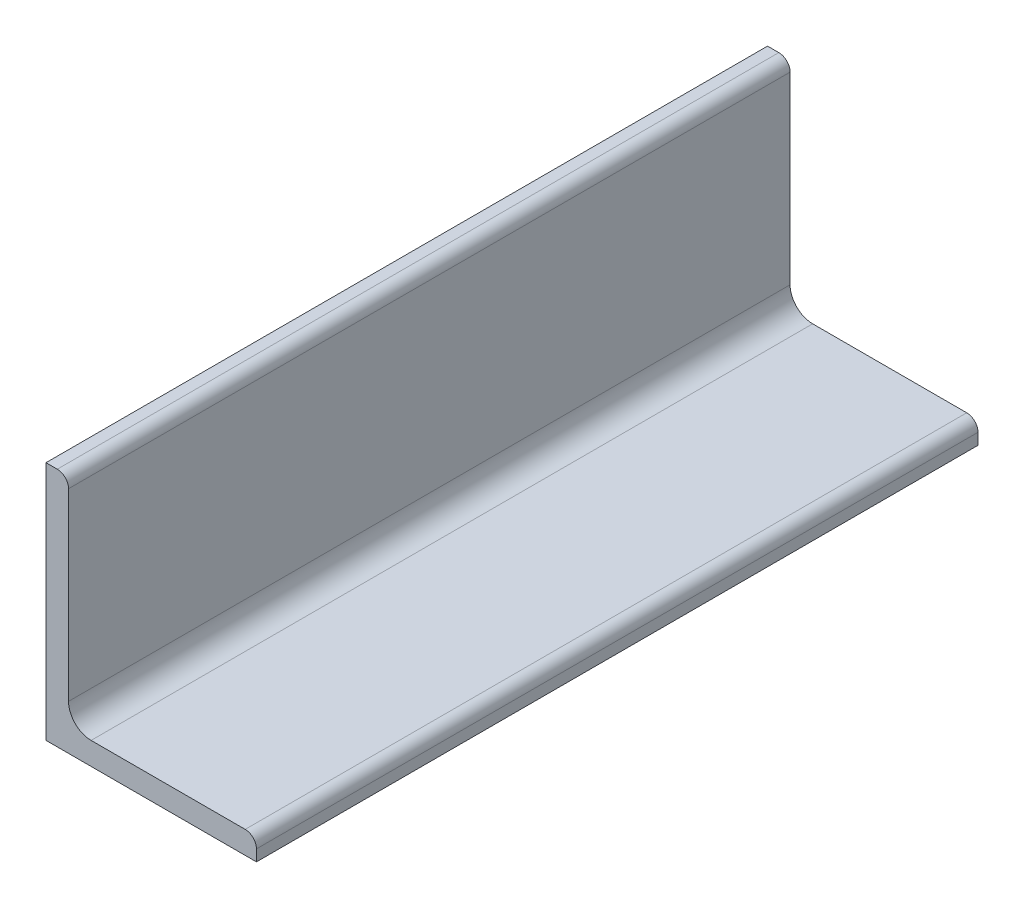
ISO-10303-21;
HEADER;
FILE_DESCRIPTION(('STEP AP214'),'2;1');
FILE_NAME('part.step','',(''),(''),'','','');
FILE_SCHEMA(('AUTOMOTIVE_DESIGN { 1 0 10303 214 1 1 1 1 }'));
ENDSEC;
DATA;
#1=APPLICATION_CONTEXT('core data for automotive mechanical design processes');
#2=APPLICATION_PROTOCOL_DEFINITION('international standard','automotive_design',2000,#1);
#3=PRODUCT_CONTEXT('',#1,'mechanical');
#4=PRODUCT('Part','Part','',(#3));
#5=PRODUCT_RELATED_PRODUCT_CATEGORY('part','',(#4));
#6=PRODUCT_DEFINITION_FORMATION('','',#4);
#7=PRODUCT_DEFINITION_CONTEXT('part definition',#1,'design');
#8=PRODUCT_DEFINITION('design','',#6,#7);
#9=PRODUCT_DEFINITION_SHAPE('','',#8);
#10=(LENGTH_UNIT() NAMED_UNIT(*) SI_UNIT(.MILLI.,.METRE.));
#11=(NAMED_UNIT(*) PLANE_ANGLE_UNIT() SI_UNIT($,.RADIAN.));
#12=(NAMED_UNIT(*) SI_UNIT($,.STERADIAN.) SOLID_ANGLE_UNIT());
#13=UNCERTAINTY_MEASURE_WITH_UNIT(LENGTH_MEASURE(1.E-05),#10,'distance_accuracy_value','');
#14=(GEOMETRIC_REPRESENTATION_CONTEXT(3) GLOBAL_UNCERTAINTY_ASSIGNED_CONTEXT((#13)) GLOBAL_UNIT_ASSIGNED_CONTEXT((#10,
#11,#12)) REPRESENTATION_CONTEXT('',''));
#15=CARTESIAN_POINT('',(0.,0.,0.));
#16=DIRECTION('',(0.,0.,1.));
#17=DIRECTION('',(1.,0.,0.));
#18=AXIS2_PLACEMENT_3D('',#15,#16,#17);
#19=CARTESIAN_POINT('',(0.0836264027816469,102.172018782971,304.8));
#20=DIRECTION('',(1.,0.,0.));
#21=DIRECTION('',(0.,0.,-1.));
#22=AXIS2_PLACEMENT_3D('',#19,#20,#21);
#23=PLANE('',#22);
#24=DIRECTION('',(0.,-1.,0.));
#25=VECTOR('',#24,1.);
#26=CARTESIAN_POINT('',(0.0836264027816469,102.172018782971,0.));
#27=LINE('',#26,#25);
#28=CARTESIAN_POINT('',(0.0836264027816469,102.172018782971,0.));
#29=VERTEX_POINT('',#28);
#30=CARTESIAN_POINT('',(0.0836264027816469,0.572018782971054,0.));
#31=VERTEX_POINT('',#30);
#32=EDGE_CURVE('E135',#29,#31,#27,.T.);
#33=ORIENTED_EDGE('',*,*,#32,.T.);
#34=DIRECTION('',(0.,0.,-1.));
#35=VECTOR('',#34,1.);
#36=CARTESIAN_POINT('',(0.0836264027816469,0.572018782971054,304.8));
#37=LINE('',#36,#35);
#38=CARTESIAN_POINT('',(0.0836264027816469,0.572018782971054,304.8));
#39=VERTEX_POINT('',#38);
#40=EDGE_CURVE('E11',#39,#31,#37,.T.);
#41=ORIENTED_EDGE('',*,*,#40,.F.);
#42=DIRECTION('',(0.,-1.,0.));
#43=VECTOR('',#42,1.);
#44=CARTESIAN_POINT('',(0.0836264027816469,102.172018782971,304.8));
#45=LINE('',#44,#43);
#46=CARTESIAN_POINT('',(0.0836264027816469,102.172018782971,304.8));
#47=VERTEX_POINT('',#46);
#48=EDGE_CURVE('E151',#47,#39,#45,.T.);
#49=ORIENTED_EDGE('',*,*,#48,.F.);
#50=DIRECTION('',(0.,0.,-1.));
#51=VECTOR('',#50,1.);
#52=CARTESIAN_POINT('',(0.0836264027816469,102.172018782971,304.8));
#53=LINE('',#52,#51);
#54=EDGE_CURVE('E131',#47,#29,#53,.T.);
#55=ORIENTED_EDGE('',*,*,#54,.T.);
#56=EDGE_LOOP('',(#33,#41,#49,#55));
#57=FACE_BOUND('',#56,.T.);
#58=ADVANCED_FACE('F33',(#57),#23,.F.);
#59=CARTESIAN_POINT('',(0.0836264027816469,0.572018782971054,304.8));
#60=DIRECTION('',(0.,1.,0.));
#61=DIRECTION('',(0.,0.,1.));
#62=AXIS2_PLACEMENT_3D('',#59,#60,#61);
#63=PLANE('',#62);
#64=DIRECTION('',(1.,0.,0.));
#65=VECTOR('',#64,1.);
#66=CARTESIAN_POINT('',(0.0836264027816469,0.572018782971054,0.));
#67=LINE('',#66,#65);
#68=CARTESIAN_POINT('',(88.9836264027817,0.572018782971054,0.));
#69=VERTEX_POINT('',#68);
#70=EDGE_CURVE('E138',#31,#69,#67,.T.);
#71=ORIENTED_EDGE('',*,*,#70,.T.);
#72=DIRECTION('',(0.,0.,-1.));
#73=VECTOR('',#72,1.);
#74=CARTESIAN_POINT('',(88.9836264027817,0.572018782971054,304.8));
#75=LINE('',#74,#73);
#76=CARTESIAN_POINT('',(88.9836264027817,0.572018782971054,304.8));
#77=VERTEX_POINT('',#76);
#78=EDGE_CURVE('E41',#77,#69,#75,.T.);
#79=ORIENTED_EDGE('',*,*,#78,.F.);
#80=DIRECTION('',(1.,0.,0.));
#81=VECTOR('',#80,1.);
#82=CARTESIAN_POINT('',(0.0836264027816469,0.572018782971054,304.8));
#83=LINE('',#82,#81);
#84=EDGE_CURVE('E95',#39,#77,#83,.T.);
#85=ORIENTED_EDGE('',*,*,#84,.F.);
#86=ORIENTED_EDGE('',*,*,#40,.T.);
#87=EDGE_LOOP('',(#71,#79,#85,#86));
#88=FACE_BOUND('',#87,.T.);
#89=ADVANCED_FACE('F194',(#88),#63,.F.);
#90=CARTESIAN_POINT('',(88.9836264027817,0.572018782971054,304.8));
#91=DIRECTION('',(-1.,0.,0.));
#92=DIRECTION('',(0.,0.,1.));
#93=AXIS2_PLACEMENT_3D('',#90,#91,#92);
#94=PLANE('',#93);
#95=DIRECTION('',(0.,1.,0.));
#96=VECTOR('',#95,1.);
#97=CARTESIAN_POINT('',(88.9836264027817,0.572018782971054,0.));
#98=LINE('',#97,#96);
#99=CARTESIAN_POINT('',(88.9836264027817,5.33451878297105,0.));
#100=VERTEX_POINT('',#99);
#101=EDGE_CURVE('E140',#69,#100,#98,.T.);
#102=ORIENTED_EDGE('',*,*,#101,.T.);
#103=DIRECTION('',(0.,0.,-1.));
#104=VECTOR('',#103,1.);
#105=CARTESIAN_POINT('',(88.9836264027817,5.33451878297105,304.8));
#106=LINE('',#105,#104);
#107=CARTESIAN_POINT('',(88.9836264027817,5.33451878297105,304.8));
#108=VERTEX_POINT('',#107);
#109=EDGE_CURVE('E161',#108,#100,#106,.T.);
#110=ORIENTED_EDGE('',*,*,#109,.F.);
#111=DIRECTION('',(0.,1.,0.));
#112=VECTOR('',#111,1.);
#113=CARTESIAN_POINT('',(88.9836264027817,0.572018782971054,304.8));
#114=LINE('',#113,#112);
#115=EDGE_CURVE('E169',#77,#108,#114,.T.);
#116=ORIENTED_EDGE('',*,*,#115,.F.);
#117=ORIENTED_EDGE('',*,*,#78,.T.);
#118=EDGE_LOOP('',(#102,#110,#116,#117));
#119=FACE_BOUND('',#118,.T.);
#120=ADVANCED_FACE('F167',(#119),#94,.F.);
#121=CARTESIAN_POINT('',(84.2211264027816,5.33451878297105,304.8));
#122=DIRECTION('',(0.,0.,-1.));
#123=DIRECTION('',(-1.,0.,0.));
#124=AXIS2_PLACEMENT_3D('',#121,#122,#123);
#125=CYLINDRICAL_SURFACE('',#124,4.7625);
#126=CARTESIAN_POINT('',(84.2211264027816,5.33451878297105,0.));
#127=DIRECTION('',(0.,0.,1.));
#128=DIRECTION('',(1.,0.,0.));
#129=AXIS2_PLACEMENT_3D('',#126,#127,#128);
#130=CIRCLE('',#129,4.7625);
#131=CARTESIAN_POINT('',(84.2211264027816,10.0970187829711,0.));
#132=VERTEX_POINT('',#131);
#133=EDGE_CURVE('E142',#100,#132,#130,.T.);
#134=ORIENTED_EDGE('',*,*,#133,.T.);
#135=DIRECTION('',(0.,0.,-1.));
#136=VECTOR('',#135,1.);
#137=CARTESIAN_POINT('',(84.2211264027816,10.0970187829711,304.8));
#138=LINE('',#137,#136);
#139=CARTESIAN_POINT('',(84.2211264027816,10.0970187829711,304.8));
#140=VERTEX_POINT('',#139);
#141=EDGE_CURVE('E158',#140,#132,#138,.T.);
#142=ORIENTED_EDGE('',*,*,#141,.F.);
#143=CARTESIAN_POINT('',(84.2211264027816,5.33451878297105,304.8));
#144=DIRECTION('',(0.,0.,1.));
#145=DIRECTION('',(1.,0.,0.));
#146=AXIS2_PLACEMENT_3D('',#143,#144,#145);
#147=CIRCLE('',#146,4.7625);
#148=EDGE_CURVE('E185',#108,#140,#147,.T.);
#149=ORIENTED_EDGE('',*,*,#148,.F.);
#150=ORIENTED_EDGE('',*,*,#109,.T.);
#151=EDGE_LOOP('',(#134,#142,#149,#150));
#152=FACE_BOUND('',#151,.T.);
#153=ADVANCED_FACE('F178',(#152),#125,.T.);
#154=CARTESIAN_POINT('',(84.2211264027816,10.0970187829711,304.8));
#155=DIRECTION('',(0.,-1.,0.));
#156=DIRECTION('',(0.,0.,-1.));
#157=AXIS2_PLACEMENT_3D('',#154,#155,#156);
#158=PLANE('',#157);
#159=DIRECTION('',(-1.,0.,0.));
#160=VECTOR('',#159,1.);
#161=CARTESIAN_POINT('',(84.2211264027816,10.0970187829711,0.));
#162=LINE('',#161,#160);
#163=CARTESIAN_POINT('',(19.1336264027816,10.0970187829711,0.));
#164=VERTEX_POINT('',#163);
#165=EDGE_CURVE('E144',#132,#164,#162,.T.);
#166=ORIENTED_EDGE('',*,*,#165,.T.);
#167=DIRECTION('',(0.,0.,-1.));
#168=VECTOR('',#167,1.);
#169=CARTESIAN_POINT('',(19.1336264027816,10.0970187829711,304.8));
#170=LINE('',#169,#168);
#171=CARTESIAN_POINT('',(19.1336264027816,10.0970187829711,304.8));
#172=VERTEX_POINT('',#171);
#173=EDGE_CURVE('E155',#172,#164,#170,.T.);
#174=ORIENTED_EDGE('',*,*,#173,.F.);
#175=DIRECTION('',(-1.,0.,0.));
#176=VECTOR('',#175,1.);
#177=CARTESIAN_POINT('',(84.2211264027816,10.0970187829711,304.8));
#178=LINE('',#177,#176);
#179=EDGE_CURVE('E184',#140,#172,#178,.T.);
#180=ORIENTED_EDGE('',*,*,#179,.F.);
#181=ORIENTED_EDGE('',*,*,#141,.T.);
#182=EDGE_LOOP('',(#166,#174,#180,#181));
#183=FACE_BOUND('',#182,.T.);
#184=ADVANCED_FACE('F182',(#183),#158,.F.);
#185=CARTESIAN_POINT('',(19.1336264027816,19.622018782971,304.8));
#186=DIRECTION('',(0.,0.,-1.));
#187=DIRECTION('',(-1.,0.,0.));
#188=AXIS2_PLACEMENT_3D('',#185,#186,#187);
#189=CYLINDRICAL_SURFACE('',#188,9.52499999999999);
#190=CARTESIAN_POINT('',(19.1336264027816,19.622018782971,0.));
#191=DIRECTION('',(0.,0.,-1.));
#192=DIRECTION('',(1.,0.,0.));
#193=AXIS2_PLACEMENT_3D('',#190,#191,#192);
#194=CIRCLE('',#193,9.52499999999999);
#195=CARTESIAN_POINT('',(9.60862640278165,19.6220187829711,0.));
#196=VERTEX_POINT('',#195);
#197=EDGE_CURVE('E146',#164,#196,#194,.T.);
#198=ORIENTED_EDGE('',*,*,#197,.T.);
#199=DIRECTION('',(0.,0.,-1.));
#200=VECTOR('',#199,1.);
#201=CARTESIAN_POINT('',(9.60862640278165,19.6220187829711,304.8));
#202=LINE('',#201,#200);
#203=CARTESIAN_POINT('',(9.60862640278165,19.6220187829711,304.8));
#204=VERTEX_POINT('',#203);
#205=EDGE_CURVE('E126',#204,#196,#202,.T.);
#206=ORIENTED_EDGE('',*,*,#205,.F.);
#207=CARTESIAN_POINT('',(19.1336264027816,19.622018782971,304.8));
#208=DIRECTION('',(0.,0.,-1.));
#209=DIRECTION('',(1.,0.,0.));
#210=AXIS2_PLACEMENT_3D('',#207,#208,#209);
#211=CIRCLE('',#210,9.52499999999999);
#212=EDGE_CURVE('E117',#172,#204,#211,.T.);
#213=ORIENTED_EDGE('',*,*,#212,.F.);
#214=ORIENTED_EDGE('',*,*,#173,.T.);
#215=EDGE_LOOP('',(#198,#206,#213,#214));
#216=FACE_BOUND('',#215,.T.);
#217=ADVANCED_FACE('F206',(#216),#189,.F.);
#218=CARTESIAN_POINT('',(9.60862640278165,19.6220187829711,304.8));
#219=DIRECTION('',(-1.,0.,0.));
#220=DIRECTION('',(0.,0.,1.));
#221=AXIS2_PLACEMENT_3D('',#218,#219,#220);
#222=PLANE('',#221);
#223=DIRECTION('',(0.,1.,0.));
#224=VECTOR('',#223,1.);
#225=CARTESIAN_POINT('',(9.60862640278165,19.6220187829711,0.));
#226=LINE('',#225,#224);
#227=CARTESIAN_POINT('',(9.60862640278165,97.409518782971,0.));
#228=VERTEX_POINT('',#227);
#229=EDGE_CURVE('E125',#196,#228,#226,.T.);
#230=ORIENTED_EDGE('',*,*,#229,.T.);
#231=DIRECTION('',(0.,0.,-1.));
#232=VECTOR('',#231,1.);
#233=CARTESIAN_POINT('',(9.60862640278165,97.409518782971,304.8));
#234=LINE('',#233,#232);
#235=CARTESIAN_POINT('',(9.60862640278165,97.409518782971,304.8));
#236=VERTEX_POINT('',#235);
#237=EDGE_CURVE('E122',#236,#228,#234,.T.);
#238=ORIENTED_EDGE('',*,*,#237,.F.);
#239=DIRECTION('',(0.,1.,0.));
#240=VECTOR('',#239,1.);
#241=CARTESIAN_POINT('',(9.60862640278165,19.6220187829711,304.8));
#242=LINE('',#241,#240);
#243=EDGE_CURVE('E111',#204,#236,#242,.T.);
#244=ORIENTED_EDGE('',*,*,#243,.F.);
#245=ORIENTED_EDGE('',*,*,#205,.T.);
#246=EDGE_LOOP('',(#230,#238,#244,#245));
#247=FACE_BOUND('',#246,.T.);
#248=ADVANCED_FACE('F123',(#247),#222,.F.);
#249=CARTESIAN_POINT('',(4.84612640278165,97.409518782971,304.8));
#250=DIRECTION('',(0.,0.,-1.));
#251=DIRECTION('',(-1.,0.,0.));
#252=AXIS2_PLACEMENT_3D('',#249,#250,#251);
#253=CYLINDRICAL_SURFACE('',#252,4.7625);
#254=CARTESIAN_POINT('',(4.84612640278165,97.409518782971,0.));
#255=DIRECTION('',(0.,0.,1.));
#256=DIRECTION('',(1.,0.,0.));
#257=AXIS2_PLACEMENT_3D('',#254,#255,#256);
#258=CIRCLE('',#257,4.7625);
#259=CARTESIAN_POINT('',(4.84612640278165,102.172018782971,0.));
#260=VERTEX_POINT('',#259);
#261=EDGE_CURVE('E81',#228,#260,#258,.T.);
#262=ORIENTED_EDGE('',*,*,#261,.T.);
#263=DIRECTION('',(0.,0.,-1.));
#264=VECTOR('',#263,1.);
#265=CARTESIAN_POINT('',(4.84612640278165,102.172018782971,304.8));
#266=LINE('',#265,#264);
#267=CARTESIAN_POINT('',(4.84612640278165,102.172018782971,304.8));
#268=VERTEX_POINT('',#267);
#269=EDGE_CURVE('E127',#268,#260,#266,.T.);
#270=ORIENTED_EDGE('',*,*,#269,.F.);
#271=CARTESIAN_POINT('',(4.84612640278165,97.409518782971,304.8));
#272=DIRECTION('',(0.,0.,1.));
#273=DIRECTION('',(1.,0.,0.));
#274=AXIS2_PLACEMENT_3D('',#271,#272,#273);
#275=CIRCLE('',#274,4.7625);
#276=EDGE_CURVE('E115',#236,#268,#275,.T.);
#277=ORIENTED_EDGE('',*,*,#276,.F.);
#278=ORIENTED_EDGE('',*,*,#237,.T.);
#279=EDGE_LOOP('',(#262,#270,#277,#278));
#280=FACE_BOUND('',#279,.T.);
#281=ADVANCED_FACE('F129',(#280),#253,.T.);
#282=CARTESIAN_POINT('',(4.84612640278165,102.172018782971,304.8));
#283=DIRECTION('',(0.,-1.,0.));
#284=DIRECTION('',(0.,0.,-1.));
#285=AXIS2_PLACEMENT_3D('',#282,#283,#284);
#286=PLANE('',#285);
#287=DIRECTION('',(-1.,0.,0.));
#288=VECTOR('',#287,1.);
#289=CARTESIAN_POINT('',(4.84612640278165,102.172018782971,0.));
#290=LINE('',#289,#288);
#291=EDGE_CURVE('E87',#260,#29,#290,.T.);
#292=ORIENTED_EDGE('',*,*,#291,.T.);
#293=ORIENTED_EDGE('',*,*,#54,.F.);
#294=DIRECTION('',(-1.,0.,0.));
#295=VECTOR('',#294,1.);
#296=CARTESIAN_POINT('',(4.84612640278165,102.172018782971,304.8));
#297=LINE('',#296,#295);
#298=EDGE_CURVE('E49',#268,#47,#297,.T.);
#299=ORIENTED_EDGE('',*,*,#298,.F.);
#300=ORIENTED_EDGE('',*,*,#269,.T.);
#301=EDGE_LOOP('',(#292,#293,#299,#300));
#302=FACE_BOUND('',#301,.T.);
#303=ADVANCED_FACE('F214',(#302),#286,.F.);
#304=CARTESIAN_POINT('',(84.2211264027816,5.33451878297105,304.8));
#305=DIRECTION('',(0.,0.,1.));
#306=DIRECTION('',(1.,0.,0.));
#307=AXIS2_PLACEMENT_3D('',#304,#305,#306);
#308=PLANE('',#307);
#309=ORIENTED_EDGE('',*,*,#48,.T.);
#310=ORIENTED_EDGE('',*,*,#84,.T.);
#311=ORIENTED_EDGE('',*,*,#115,.T.);
#312=ORIENTED_EDGE('',*,*,#148,.T.);
#313=ORIENTED_EDGE('',*,*,#179,.T.);
#314=ORIENTED_EDGE('',*,*,#212,.T.);
#315=ORIENTED_EDGE('',*,*,#243,.T.);
#316=ORIENTED_EDGE('',*,*,#276,.T.);
#317=ORIENTED_EDGE('',*,*,#298,.T.);
#318=EDGE_LOOP('',(#309,#310,#311,#312,#313,#314,#315,#316,#317));
#319=FACE_BOUND('',#318,.T.);
#320=ADVANCED_FACE('F113',(#319),#308,.T.);
#321=CARTESIAN_POINT('',(84.2211264027816,5.33451878297105,0.));
#322=DIRECTION('',(0.,0.,1.));
#323=DIRECTION('',(1.,0.,0.));
#324=AXIS2_PLACEMENT_3D('',#321,#322,#323);
#325=PLANE('',#324);
#326=ORIENTED_EDGE('',*,*,#32,.F.);
#327=ORIENTED_EDGE('',*,*,#291,.F.);
#328=ORIENTED_EDGE('',*,*,#261,.F.);
#329=ORIENTED_EDGE('',*,*,#229,.F.);
#330=ORIENTED_EDGE('',*,*,#197,.F.);
#331=ORIENTED_EDGE('',*,*,#165,.F.);
#332=ORIENTED_EDGE('',*,*,#133,.F.);
#333=ORIENTED_EDGE('',*,*,#101,.F.);
#334=ORIENTED_EDGE('',*,*,#70,.F.);
#335=EDGE_LOOP('',(#326,#327,#328,#329,#330,#331,#332,#333,#334));
#336=FACE_BOUND('',#335,.T.);
#337=ADVANCED_FACE('F173',(#336),#325,.F.);
#338=CLOSED_SHELL('',(#58,#89,#120,#153,#184,#217,#248,#281,#303,#320,#337));
#339=MANIFOLD_SOLID_BREP('B2',#338);
#340=ADVANCED_BREP_SHAPE_REPRESENTATION('',(#18,#339),#14);
#341=SHAPE_DEFINITION_REPRESENTATION(#9,#340);
ENDSEC;
END-ISO-10303-21;
